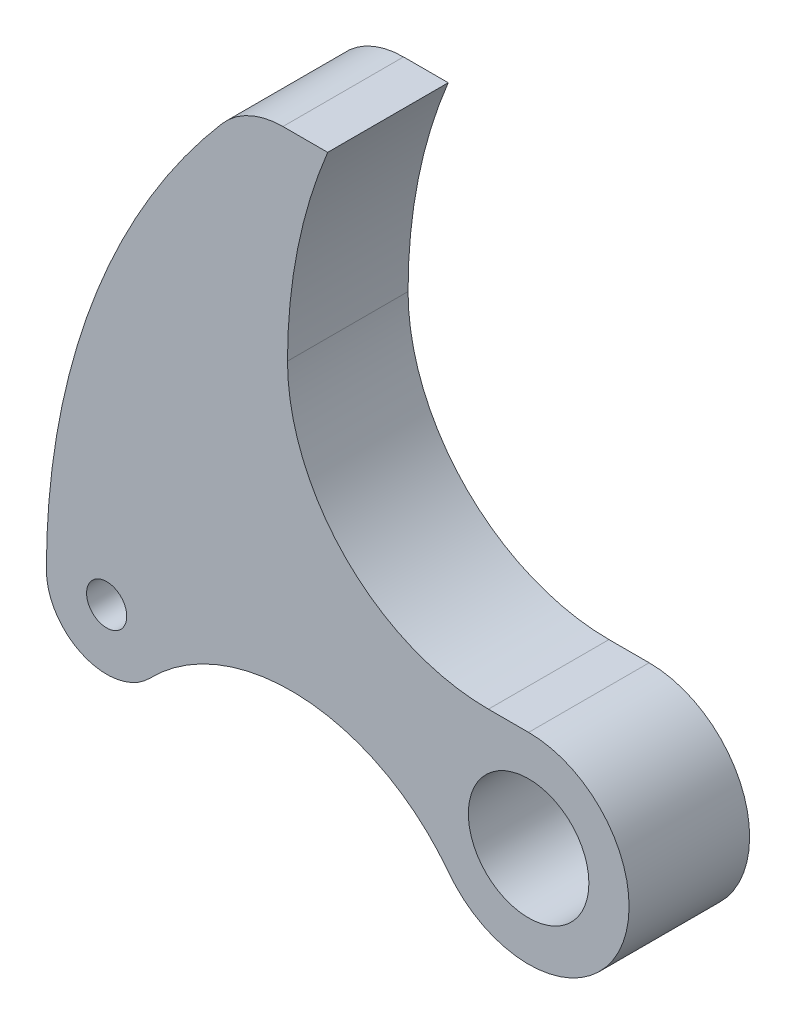
ISO-10303-21;
HEADER;
FILE_DESCRIPTION(('STEP AP214'),'2;1');
FILE_NAME('part.step','',(''),(''),'','','');
FILE_SCHEMA(('AUTOMOTIVE_DESIGN { 1 0 10303 214 1 1 1 1 }'));
ENDSEC;
DATA;
#1=APPLICATION_CONTEXT('core data for automotive mechanical design processes');
#2=APPLICATION_PROTOCOL_DEFINITION('international standard','automotive_design',2000,#1);
#3=PRODUCT_CONTEXT('',#1,'mechanical');
#4=PRODUCT('Part','Part','',(#3));
#5=PRODUCT_RELATED_PRODUCT_CATEGORY('part','',(#4));
#6=PRODUCT_DEFINITION_FORMATION('','',#4);
#7=PRODUCT_DEFINITION_CONTEXT('part definition',#1,'design');
#8=PRODUCT_DEFINITION('design','',#6,#7);
#9=PRODUCT_DEFINITION_SHAPE('','',#8);
#10=(LENGTH_UNIT() NAMED_UNIT(*) SI_UNIT(.MILLI.,.METRE.));
#11=(NAMED_UNIT(*) PLANE_ANGLE_UNIT() SI_UNIT($,.RADIAN.));
#12=(NAMED_UNIT(*) SI_UNIT($,.STERADIAN.) SOLID_ANGLE_UNIT());
#13=UNCERTAINTY_MEASURE_WITH_UNIT(LENGTH_MEASURE(1.E-05),#10,'distance_accuracy_value','');
#14=(GEOMETRIC_REPRESENTATION_CONTEXT(3) GLOBAL_UNCERTAINTY_ASSIGNED_CONTEXT((#13)) GLOBAL_UNIT_ASSIGNED_CONTEXT((#10,
#11,#12)) REPRESENTATION_CONTEXT('',''));
#15=CARTESIAN_POINT('',(0.,0.,0.));
#16=DIRECTION('',(0.,0.,1.));
#17=DIRECTION('',(1.,0.,0.));
#18=AXIS2_PLACEMENT_3D('',#15,#16,#17);
#19=CARTESIAN_POINT('',(0.,37.5,3.));
#20=DIRECTION('',(0.,0.,1.));
#21=DIRECTION('',(1.,0.,0.));
#22=AXIS2_PLACEMENT_3D('',#19,#20,#21);
#23=PLANE('',#22);
#24=CARTESIAN_POINT('',(0.,37.5,3.));
#25=DIRECTION('',(0.,0.,1.));
#26=DIRECTION('',(1.,0.,0.));
#27=AXIS2_PLACEMENT_3D('',#24,#25,#26);
#28=CIRCLE('',#27,1.5);
#29=CARTESIAN_POINT('',(1.5,37.5,3.));
#30=VERTEX_POINT('',#29);
#31=EDGE_CURVE('E139',#30,#30,#28,.T.);
#32=ORIENTED_EDGE('',*,*,#31,.F.);
#33=EDGE_LOOP('',(#32));
#34=FACE_BOUND('',#33,.T.);
#35=CARTESIAN_POINT('',(0.,37.5,3.));
#36=DIRECTION('',(0.,0.,1.));
#37=DIRECTION('',(1.,0.,0.));
#38=AXIS2_PLACEMENT_3D('',#35,#36,#37);
#39=CIRCLE('',#38,2.5);
#40=CARTESIAN_POINT('',(-1.99587526379754,35.9945160474581,3.));
#41=VERTEX_POINT('',#40);
#42=CARTESIAN_POINT('',(0.,40.,3.));
#43=VERTEX_POINT('',#42);
#44=EDGE_CURVE('E152',#41,#43,#39,.T.);
#45=ORIENTED_EDGE('',*,*,#44,.T.);
#46=DIRECTION('',(-1.,0.,0.));
#47=VECTOR('',#46,1.);
#48=CARTESIAN_POINT('',(-0.999999999999998,40.,3.));
#49=LINE('',#48,#47);
#50=CARTESIAN_POINT('',(-0.999999999999998,40.,3.));
#51=VERTEX_POINT('',#50);
#52=EDGE_CURVE('E95',#43,#51,#49,.T.);
#53=ORIENTED_EDGE('',*,*,#52,.T.);
#54=CARTESIAN_POINT('',(-0.999999999999998,45.,3.));
#55=DIRECTION('',(0.,0.,-1.));
#56=DIRECTION('',(1.,0.,0.));
#57=AXIS2_PLACEMENT_3D('',#54,#55,#56);
#58=CIRCLE('',#57,5.);
#59=CARTESIAN_POINT('',(-6.,45.,3.));
#60=VERTEX_POINT('',#59);
#61=EDGE_CURVE('E170',#51,#60,#58,.T.);
#62=ORIENTED_EDGE('',*,*,#61,.T.);
#63=CARTESIAN_POINT('',(6.99999999999995,45.,3.));
#64=DIRECTION('',(0.,0.,-1.));
#65=DIRECTION('',(1.,0.,0.));
#66=AXIS2_PLACEMENT_3D('',#63,#64,#65);
#67=CIRCLE('',#66,12.9999999999999);
#68=CARTESIAN_POINT('',(-5.,50.,3.));
#69=VERTEX_POINT('',#68);
#70=EDGE_CURVE('E187',#60,#69,#67,.T.);
#71=ORIENTED_EDGE('',*,*,#70,.T.);
#72=DIRECTION('',(-1.,0.,0.));
#73=VECTOR('',#72,1.);
#74=CARTESIAN_POINT('',(-4.99999999999999,50.,3.));
#75=LINE('',#74,#73);
#76=CARTESIAN_POINT('',(-6.11287665406054,50.,3.));
#77=VERTEX_POINT('',#76);
#78=EDGE_CURVE('E186',#69,#77,#75,.T.);
#79=ORIENTED_EDGE('',*,*,#78,.T.);
#80=CARTESIAN_POINT('',(-6.11287665406054,48.,3.));
#81=DIRECTION('',(0.,0.,1.));
#82=DIRECTION('',(1.,0.,0.));
#83=AXIS2_PLACEMENT_3D('',#80,#81,#82);
#84=CIRCLE('',#83,2.);
#85=CARTESIAN_POINT('',(-7.63075282820758,49.3023255813954,3.));
#86=VERTEX_POINT('',#85);
#87=EDGE_CURVE('E117',#77,#86,#84,.T.);
#88=ORIENTED_EDGE('',*,*,#87,.T.);
#89=CARTESIAN_POINT('',(6.12500000000001,37.5,3.));
#90=DIRECTION('',(0.,0.,1.));
#91=DIRECTION('',(1.,0.,0.));
#92=AXIS2_PLACEMENT_3D('',#89,#90,#91);
#93=CIRCLE('',#92,18.125);
#94=CARTESIAN_POINT('',(-12.,37.5,3.));
#95=VERTEX_POINT('',#94);
#96=EDGE_CURVE('E111',#86,#95,#93,.T.);
#97=ORIENTED_EDGE('',*,*,#96,.T.);
#98=CARTESIAN_POINT('',(-10.5,37.5,3.));
#99=DIRECTION('',(0.,0.,1.));
#100=DIRECTION('',(1.,0.,0.));
#101=AXIS2_PLACEMENT_3D('',#98,#99,#100);
#102=CIRCLE('',#101,1.5);
#103=CARTESIAN_POINT('',(-9.42337351893475,36.455550182982,3.));
#104=VERTEX_POINT('',#103);
#105=EDGE_CURVE('E115',#95,#104,#102,.T.);
#106=ORIENTED_EDGE('',*,*,#105,.T.);
#107=CARTESIAN_POINT('',(-5.90705509442804,33.044322426983,3.));
#108=DIRECTION('',(0.,0.,-1.));
#109=DIRECTION('',(-1.,0.,0.));
#110=AXIS2_PLACEMENT_3D('',#107,#108,#109);
#111=CIRCLE('',#110,4.89907849149441);
#112=EDGE_CURVE('E49',#104,#41,#111,.T.);
#113=ORIENTED_EDGE('',*,*,#112,.T.);
#114=EDGE_LOOP('',(#45,#53,#62,#71,#79,#88,#97,#106,#113));
#115=FACE_BOUND('',#114,.T.);
#116=CARTESIAN_POINT('',(-10.5,37.5,3.));
#117=DIRECTION('',(0.,0.,1.));
#118=DIRECTION('',(1.,0.,0.));
#119=AXIS2_PLACEMENT_3D('',#116,#117,#118);
#120=CIRCLE('',#119,0.500000000000001);
#121=CARTESIAN_POINT('',(-10.,37.5,3.));
#122=VERTEX_POINT('',#121);
#123=EDGE_CURVE('E197',#122,#122,#120,.T.);
#124=ORIENTED_EDGE('',*,*,#123,.F.);
#125=EDGE_LOOP('',(#124));
#126=FACE_BOUND('',#125,.T.);
#127=ADVANCED_FACE('F32',(#34,#115,#126),#23,.T.);
#128=CARTESIAN_POINT('',(0.,37.5,0.));
#129=DIRECTION('',(0.,0.,1.));
#130=DIRECTION('',(1.,0.,0.));
#131=AXIS2_PLACEMENT_3D('',#128,#129,#130);
#132=PLANE('',#131);
#133=CARTESIAN_POINT('',(0.,37.5,0.));
#134=DIRECTION('',(0.,0.,1.));
#135=DIRECTION('',(1.,0.,0.));
#136=AXIS2_PLACEMENT_3D('',#133,#134,#135);
#137=CIRCLE('',#136,1.5);
#138=CARTESIAN_POINT('',(1.5,37.5,0.));
#139=VERTEX_POINT('',#138);
#140=EDGE_CURVE('E194',#139,#139,#137,.T.);
#141=ORIENTED_EDGE('',*,*,#140,.T.);
#142=EDGE_LOOP('',(#141));
#143=FACE_BOUND('',#142,.T.);
#144=CARTESIAN_POINT('',(0.,37.5,0.));
#145=DIRECTION('',(0.,0.,1.));
#146=DIRECTION('',(1.,0.,0.));
#147=AXIS2_PLACEMENT_3D('',#144,#145,#146);
#148=CIRCLE('',#147,2.5);
#149=CARTESIAN_POINT('',(-1.99587526379754,35.9945160474581,0.));
#150=VERTEX_POINT('',#149);
#151=CARTESIAN_POINT('',(0.,40.,0.));
#152=VERTEX_POINT('',#151);
#153=EDGE_CURVE('E135',#150,#152,#148,.T.);
#154=ORIENTED_EDGE('',*,*,#153,.F.);
#155=CARTESIAN_POINT('',(-5.90705509442804,33.044322426983,0.));
#156=DIRECTION('',(0.,0.,-1.));
#157=DIRECTION('',(-1.,0.,0.));
#158=AXIS2_PLACEMENT_3D('',#155,#156,#157);
#159=CIRCLE('',#158,4.89907849149441);
#160=CARTESIAN_POINT('',(-9.42337351893475,36.455550182982,0.));
#161=VERTEX_POINT('',#160);
#162=EDGE_CURVE('E87',#161,#150,#159,.T.);
#163=ORIENTED_EDGE('',*,*,#162,.F.);
#164=CARTESIAN_POINT('',(-10.5,37.5,0.));
#165=DIRECTION('',(0.,0.,1.));
#166=DIRECTION('',(1.,0.,0.));
#167=AXIS2_PLACEMENT_3D('',#164,#165,#166);
#168=CIRCLE('',#167,1.5);
#169=CARTESIAN_POINT('',(-12.,37.5,0.));
#170=VERTEX_POINT('',#169);
#171=EDGE_CURVE('E81',#170,#161,#168,.T.);
#172=ORIENTED_EDGE('',*,*,#171,.F.);
#173=CARTESIAN_POINT('',(6.12500000000001,37.5,0.));
#174=DIRECTION('',(0.,0.,1.));
#175=DIRECTION('',(1.,0.,0.));
#176=AXIS2_PLACEMENT_3D('',#173,#174,#175);
#177=CIRCLE('',#176,18.125);
#178=CARTESIAN_POINT('',(-7.63075282820758,49.3023255813954,0.));
#179=VERTEX_POINT('',#178);
#180=EDGE_CURVE('E125',#179,#170,#177,.T.);
#181=ORIENTED_EDGE('',*,*,#180,.F.);
#182=CARTESIAN_POINT('',(-6.11287665406054,48.,0.));
#183=DIRECTION('',(0.,0.,1.));
#184=DIRECTION('',(1.,0.,0.));
#185=AXIS2_PLACEMENT_3D('',#182,#183,#184);
#186=CIRCLE('',#185,2.);
#187=CARTESIAN_POINT('',(-6.11287665406054,50.,0.));
#188=VERTEX_POINT('',#187);
#189=EDGE_CURVE('E147',#188,#179,#186,.T.);
#190=ORIENTED_EDGE('',*,*,#189,.F.);
#191=DIRECTION('',(-1.,0.,0.));
#192=VECTOR('',#191,1.);
#193=CARTESIAN_POINT('',(-4.99999999999999,50.,0.));
#194=LINE('',#193,#192);
#195=CARTESIAN_POINT('',(-5.,50.,0.));
#196=VERTEX_POINT('',#195);
#197=EDGE_CURVE('E145',#196,#188,#194,.T.);
#198=ORIENTED_EDGE('',*,*,#197,.F.);
#199=CARTESIAN_POINT('',(6.99999999999995,45.,0.));
#200=DIRECTION('',(0.,0.,-1.));
#201=DIRECTION('',(1.,0.,0.));
#202=AXIS2_PLACEMENT_3D('',#199,#200,#201);
#203=CIRCLE('',#202,12.9999999999999);
#204=CARTESIAN_POINT('',(-6.,45.,0.));
#205=VERTEX_POINT('',#204);
#206=EDGE_CURVE('E143',#205,#196,#203,.T.);
#207=ORIENTED_EDGE('',*,*,#206,.F.);
#208=CARTESIAN_POINT('',(-0.999999999999998,45.,0.));
#209=DIRECTION('',(0.,0.,-1.));
#210=DIRECTION('',(1.,0.,0.));
#211=AXIS2_PLACEMENT_3D('',#208,#209,#210);
#212=CIRCLE('',#211,5.);
#213=CARTESIAN_POINT('',(-0.999999999999998,40.,0.));
#214=VERTEX_POINT('',#213);
#215=EDGE_CURVE('E141',#214,#205,#212,.T.);
#216=ORIENTED_EDGE('',*,*,#215,.F.);
#217=DIRECTION('',(-1.,0.,0.));
#218=VECTOR('',#217,1.);
#219=CARTESIAN_POINT('',(-0.999999999999998,40.,0.));
#220=LINE('',#219,#218);
#221=EDGE_CURVE('E138',#152,#214,#220,.T.);
#222=ORIENTED_EDGE('',*,*,#221,.F.);
#223=EDGE_LOOP('',(#154,#163,#172,#181,#190,#198,#207,#216,#222));
#224=FACE_BOUND('',#223,.T.);
#225=CARTESIAN_POINT('',(-10.5,37.5,0.));
#226=DIRECTION('',(0.,0.,1.));
#227=DIRECTION('',(1.,0.,0.));
#228=AXIS2_PLACEMENT_3D('',#225,#226,#227);
#229=CIRCLE('',#228,0.500000000000001);
#230=CARTESIAN_POINT('',(-10.,37.5,0.));
#231=VERTEX_POINT('',#230);
#232=EDGE_CURVE('E200',#231,#231,#229,.T.);
#233=ORIENTED_EDGE('',*,*,#232,.T.);
#234=EDGE_LOOP('',(#233));
#235=FACE_BOUND('',#234,.T.);
#236=ADVANCED_FACE('F174',(#143,#224,#235),#132,.F.);
#237=CARTESIAN_POINT('',(0.,37.5,3.));
#238=DIRECTION('',(0.,0.,-1.));
#239=DIRECTION('',(-1.,0.,0.));
#240=AXIS2_PLACEMENT_3D('',#237,#238,#239);
#241=CYLINDRICAL_SURFACE('',#240,2.5);
#242=ORIENTED_EDGE('',*,*,#153,.T.);
#243=DIRECTION('',(0.,0.,-1.));
#244=VECTOR('',#243,1.);
#245=CARTESIAN_POINT('',(0.,40.,3.));
#246=LINE('',#245,#244);
#247=EDGE_CURVE('E11',#43,#152,#246,.T.);
#248=ORIENTED_EDGE('',*,*,#247,.F.);
#249=ORIENTED_EDGE('',*,*,#44,.F.);
#250=DIRECTION('',(0.,0.,-1.));
#251=VECTOR('',#250,1.);
#252=CARTESIAN_POINT('',(-1.99587526379754,35.9945160474581,3.));
#253=LINE('',#252,#251);
#254=EDGE_CURVE('E131',#41,#150,#253,.T.);
#255=ORIENTED_EDGE('',*,*,#254,.T.);
#256=EDGE_LOOP('',(#242,#248,#249,#255));
#257=FACE_BOUND('',#256,.T.);
#258=ADVANCED_FACE('F34',(#257),#241,.T.);
#259=CARTESIAN_POINT('',(-0.999999999999998,40.,3.));
#260=DIRECTION('',(0.,-1.,0.));
#261=DIRECTION('',(0.,0.,-1.));
#262=AXIS2_PLACEMENT_3D('',#259,#260,#261);
#263=PLANE('',#262);
#264=ORIENTED_EDGE('',*,*,#221,.T.);
#265=DIRECTION('',(0.,0.,-1.));
#266=VECTOR('',#265,1.);
#267=CARTESIAN_POINT('',(-0.999999999999998,40.,3.));
#268=LINE('',#267,#266);
#269=EDGE_CURVE('E41',#51,#214,#268,.T.);
#270=ORIENTED_EDGE('',*,*,#269,.F.);
#271=ORIENTED_EDGE('',*,*,#52,.F.);
#272=ORIENTED_EDGE('',*,*,#247,.T.);
#273=EDGE_LOOP('',(#264,#270,#271,#272));
#274=FACE_BOUND('',#273,.T.);
#275=ADVANCED_FACE('F237',(#274),#263,.F.);
#276=CARTESIAN_POINT('',(-0.999999999999998,45.,3.));
#277=DIRECTION('',(0.,0.,-1.));
#278=DIRECTION('',(-1.,0.,0.));
#279=AXIS2_PLACEMENT_3D('',#276,#277,#278);
#280=CYLINDRICAL_SURFACE('',#279,5.);
#281=ORIENTED_EDGE('',*,*,#215,.T.);
#282=DIRECTION('',(0.,0.,-1.));
#283=VECTOR('',#282,1.);
#284=CARTESIAN_POINT('',(-6.,45.,3.));
#285=LINE('',#284,#283);
#286=EDGE_CURVE('E162',#60,#205,#285,.T.);
#287=ORIENTED_EDGE('',*,*,#286,.F.);
#288=ORIENTED_EDGE('',*,*,#61,.F.);
#289=ORIENTED_EDGE('',*,*,#269,.T.);
#290=EDGE_LOOP('',(#281,#287,#288,#289));
#291=FACE_BOUND('',#290,.T.);
#292=ADVANCED_FACE('F168',(#291),#280,.F.);
#293=CARTESIAN_POINT('',(6.99999999999995,45.,3.));
#294=DIRECTION('',(0.,0.,-1.));
#295=DIRECTION('',(-1.,0.,0.));
#296=AXIS2_PLACEMENT_3D('',#293,#294,#295);
#297=CYLINDRICAL_SURFACE('',#296,12.9999999999999);
#298=ORIENTED_EDGE('',*,*,#206,.T.);
#299=DIRECTION('',(0.,0.,-1.));
#300=VECTOR('',#299,1.);
#301=CARTESIAN_POINT('',(-5.,50.,3.));
#302=LINE('',#301,#300);
#303=EDGE_CURVE('E159',#69,#196,#302,.T.);
#304=ORIENTED_EDGE('',*,*,#303,.F.);
#305=ORIENTED_EDGE('',*,*,#70,.F.);
#306=ORIENTED_EDGE('',*,*,#286,.T.);
#307=EDGE_LOOP('',(#298,#304,#305,#306));
#308=FACE_BOUND('',#307,.T.);
#309=ADVANCED_FACE('F180',(#308),#297,.F.);
#310=CARTESIAN_POINT('',(-4.99999999999999,50.,3.));
#311=DIRECTION('',(0.,-1.,0.));
#312=DIRECTION('',(0.,0.,-1.));
#313=AXIS2_PLACEMENT_3D('',#310,#311,#312);
#314=PLANE('',#313);
#315=ORIENTED_EDGE('',*,*,#197,.T.);
#316=DIRECTION('',(0.,0.,-1.));
#317=VECTOR('',#316,1.);
#318=CARTESIAN_POINT('',(-6.11287665406054,50.,3.));
#319=LINE('',#318,#317);
#320=EDGE_CURVE('E156',#77,#188,#319,.T.);
#321=ORIENTED_EDGE('',*,*,#320,.F.);
#322=ORIENTED_EDGE('',*,*,#78,.F.);
#323=ORIENTED_EDGE('',*,*,#303,.T.);
#324=EDGE_LOOP('',(#315,#321,#322,#323));
#325=FACE_BOUND('',#324,.T.);
#326=ADVANCED_FACE('F184',(#325),#314,.F.);
#327=CARTESIAN_POINT('',(-6.11287665406054,48.,3.));
#328=DIRECTION('',(0.,0.,-1.));
#329=DIRECTION('',(-1.,0.,0.));
#330=AXIS2_PLACEMENT_3D('',#327,#328,#329);
#331=CYLINDRICAL_SURFACE('',#330,2.);
#332=ORIENTED_EDGE('',*,*,#189,.T.);
#333=DIRECTION('',(0.,0.,-1.));
#334=VECTOR('',#333,1.);
#335=CARTESIAN_POINT('',(-7.63075282820758,49.3023255813954,3.));
#336=LINE('',#335,#334);
#337=EDGE_CURVE('E126',#86,#179,#336,.T.);
#338=ORIENTED_EDGE('',*,*,#337,.F.);
#339=ORIENTED_EDGE('',*,*,#87,.F.);
#340=ORIENTED_EDGE('',*,*,#320,.T.);
#341=EDGE_LOOP('',(#332,#338,#339,#340));
#342=FACE_BOUND('',#341,.T.);
#343=ADVANCED_FACE('F228',(#342),#331,.T.);
#344=CARTESIAN_POINT('',(6.12500000000001,37.5,3.));
#345=DIRECTION('',(0.,0.,-1.));
#346=DIRECTION('',(-1.,0.,0.));
#347=AXIS2_PLACEMENT_3D('',#344,#345,#346);
#348=CYLINDRICAL_SURFACE('',#347,18.125);
#349=ORIENTED_EDGE('',*,*,#180,.T.);
#350=DIRECTION('',(0.,0.,-1.));
#351=VECTOR('',#350,1.);
#352=CARTESIAN_POINT('',(-12.,37.5,3.));
#353=LINE('',#352,#351);
#354=EDGE_CURVE('E122',#95,#170,#353,.T.);
#355=ORIENTED_EDGE('',*,*,#354,.F.);
#356=ORIENTED_EDGE('',*,*,#96,.F.);
#357=ORIENTED_EDGE('',*,*,#337,.T.);
#358=EDGE_LOOP('',(#349,#355,#356,#357));
#359=FACE_BOUND('',#358,.T.);
#360=ADVANCED_FACE('F123',(#359),#348,.T.);
#361=CARTESIAN_POINT('',(-10.5,37.5,3.));
#362=DIRECTION('',(0.,0.,-1.));
#363=DIRECTION('',(-1.,0.,0.));
#364=AXIS2_PLACEMENT_3D('',#361,#362,#363);
#365=CYLINDRICAL_SURFACE('',#364,1.5);
#366=ORIENTED_EDGE('',*,*,#171,.T.);
#367=DIRECTION('',(0.,0.,-1.));
#368=VECTOR('',#367,1.);
#369=CARTESIAN_POINT('',(-9.42337351893475,36.455550182982,3.));
#370=LINE('',#369,#368);
#371=EDGE_CURVE('E127',#104,#161,#370,.T.);
#372=ORIENTED_EDGE('',*,*,#371,.F.);
#373=ORIENTED_EDGE('',*,*,#105,.F.);
#374=ORIENTED_EDGE('',*,*,#354,.T.);
#375=EDGE_LOOP('',(#366,#372,#373,#374));
#376=FACE_BOUND('',#375,.T.);
#377=ADVANCED_FACE('F129',(#376),#365,.T.);
#378=CARTESIAN_POINT('',(-5.90705509442804,33.044322426983,3.));
#379=DIRECTION('',(0.,0.,-1.));
#380=DIRECTION('',(-1.,0.,0.));
#381=AXIS2_PLACEMENT_3D('',#378,#379,#380);
#382=CYLINDRICAL_SURFACE('',#381,4.89907849149441);
#383=ORIENTED_EDGE('',*,*,#162,.T.);
#384=ORIENTED_EDGE('',*,*,#254,.F.);
#385=ORIENTED_EDGE('',*,*,#112,.F.);
#386=ORIENTED_EDGE('',*,*,#371,.T.);
#387=EDGE_LOOP('',(#383,#384,#385,#386));
#388=FACE_BOUND('',#387,.T.);
#389=ADVANCED_FACE('F221',(#388),#382,.F.);
#390=CARTESIAN_POINT('',(0.,37.5,3.));
#391=DIRECTION('',(0.,0.,-1.));
#392=DIRECTION('',(-1.,0.,0.));
#393=AXIS2_PLACEMENT_3D('',#390,#391,#392);
#394=CYLINDRICAL_SURFACE('',#393,1.5);
#395=ORIENTED_EDGE('',*,*,#31,.T.);
#396=EDGE_LOOP('',(#395));
#397=FACE_BOUND('',#396,.T.);
#398=ORIENTED_EDGE('',*,*,#140,.F.);
#399=EDGE_LOOP('',(#398));
#400=FACE_BOUND('',#399,.T.);
#401=ADVANCED_FACE('F218',(#397,#400),#394,.F.);
#402=CARTESIAN_POINT('',(-10.5,37.5,3.));
#403=DIRECTION('',(0.,0.,-1.));
#404=DIRECTION('',(-1.,0.,0.));
#405=AXIS2_PLACEMENT_3D('',#402,#403,#404);
#406=CYLINDRICAL_SURFACE('',#405,0.500000000000001);
#407=ORIENTED_EDGE('',*,*,#123,.T.);
#408=EDGE_LOOP('',(#407));
#409=FACE_BOUND('',#408,.T.);
#410=ORIENTED_EDGE('',*,*,#232,.F.);
#411=EDGE_LOOP('',(#410));
#412=FACE_BOUND('',#411,.T.);
#413=ADVANCED_FACE('F206',(#409,#412),#406,.F.);
#414=CLOSED_SHELL('',(#127,#236,#258,#275,#292,#309,#326,#343,#360,#377,#389,#401,#413));
#415=MANIFOLD_SOLID_BREP('B2',#414);
#416=ADVANCED_BREP_SHAPE_REPRESENTATION('',(#18,#415),#14);
#417=SHAPE_DEFINITION_REPRESENTATION(#9,#416);
ENDSEC;
END-ISO-10303-21;
